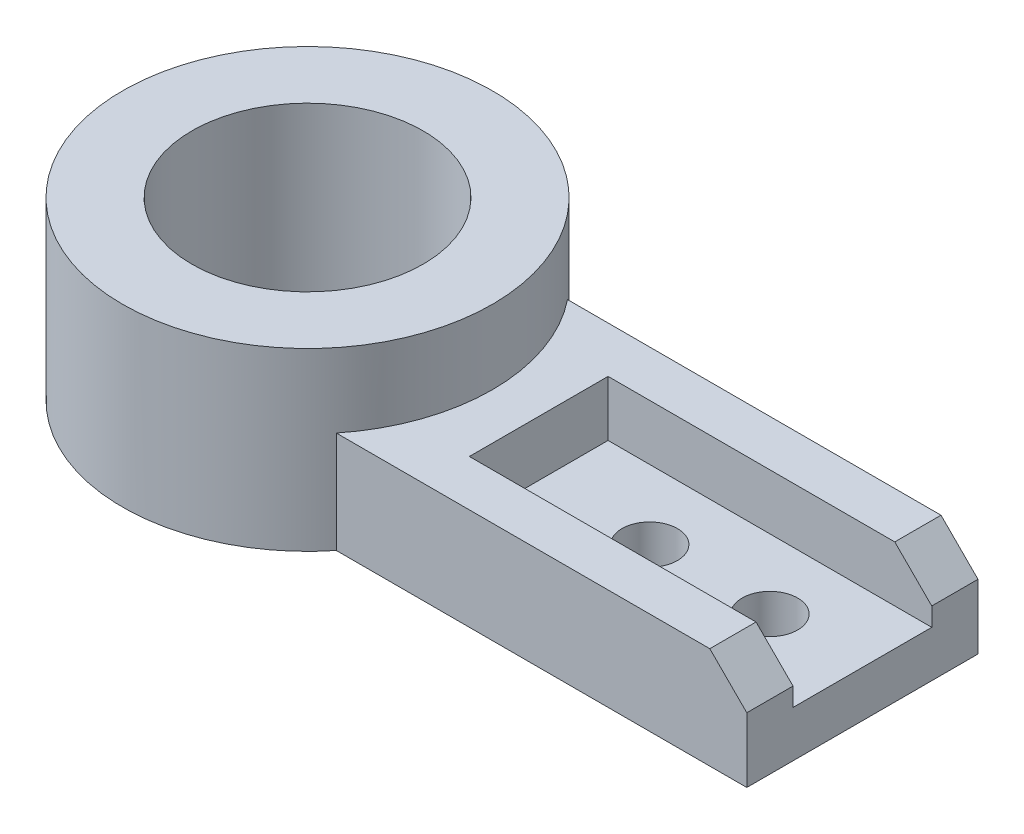
ISO-10303-21;
HEADER;
FILE_DESCRIPTION(('STEP AP214'),'2;1');
FILE_NAME('part.step','',(''),(''),'','','');
FILE_SCHEMA(('AUTOMOTIVE_DESIGN { 1 0 10303 214 1 1 1 1 }'));
ENDSEC;
DATA;
#1=APPLICATION_CONTEXT('core data for automotive mechanical design processes');
#2=APPLICATION_PROTOCOL_DEFINITION('international standard','automotive_design',2000,#1);
#3=PRODUCT_CONTEXT('',#1,'mechanical');
#4=PRODUCT('Part','Part','',(#3));
#5=PRODUCT_RELATED_PRODUCT_CATEGORY('part','',(#4));
#6=PRODUCT_DEFINITION_FORMATION('','',#4);
#7=PRODUCT_DEFINITION_CONTEXT('part definition',#1,'design');
#8=PRODUCT_DEFINITION('design','',#6,#7);
#9=PRODUCT_DEFINITION_SHAPE('','',#8);
#10=(LENGTH_UNIT() NAMED_UNIT(*) SI_UNIT(.MILLI.,.METRE.));
#11=(NAMED_UNIT(*) PLANE_ANGLE_UNIT() SI_UNIT($,.RADIAN.));
#12=(NAMED_UNIT(*) SI_UNIT($,.STERADIAN.) SOLID_ANGLE_UNIT());
#13=UNCERTAINTY_MEASURE_WITH_UNIT(LENGTH_MEASURE(1.E-05),#10,'distance_accuracy_value','');
#14=(GEOMETRIC_REPRESENTATION_CONTEXT(3) GLOBAL_UNCERTAINTY_ASSIGNED_CONTEXT((#13)) GLOBAL_UNIT_ASSIGNED_CONTEXT((#10,
#11,#12)) REPRESENTATION_CONTEXT('',''));
#15=CARTESIAN_POINT('',(0.,0.,0.));
#16=DIRECTION('',(0.,0.,1.));
#17=DIRECTION('',(1.,0.,0.));
#18=AXIS2_PLACEMENT_3D('',#15,#16,#17);
#19=CARTESIAN_POINT('',(0.,55.,0.));
#20=DIRECTION('',(0.,1.,0.));
#21=DIRECTION('',(0.,0.,1.));
#22=AXIS2_PLACEMENT_3D('',#19,#20,#21);
#23=PLANE('',#22);
#24=DIRECTION('',(-1.,0.,0.));
#25=VECTOR('',#24,1.);
#26=CARTESIAN_POINT('',(0.,55.,62.5));
#27=LINE('',#26,#25);
#28=CARTESIAN_POINT('',(280.,55.,62.5));
#29=VERTEX_POINT('',#28);
#30=CARTESIAN_POINT('',(78.06247497998,55.,62.5));
#31=VERTEX_POINT('',#30);
#32=EDGE_CURVE('E117',#29,#31,#27,.T.);
#33=ORIENTED_EDGE('',*,*,#32,.F.);
#34=DIRECTION('',(0.,0.,-1.));
#35=VECTOR('',#34,1.);
#36=CARTESIAN_POINT('',(280.,55.,0.));
#37=LINE('',#36,#35);
#38=CARTESIAN_POINT('',(280.,55.,37.5));
#39=VERTEX_POINT('',#38);
#40=EDGE_CURVE('E64',#29,#39,#37,.T.);
#41=ORIENTED_EDGE('',*,*,#40,.T.);
#42=DIRECTION('',(1.,0.,0.));
#43=VECTOR('',#42,1.);
#44=CARTESIAN_POINT('',(0.,55.,37.5));
#45=LINE('',#44,#43);
#46=CARTESIAN_POINT('',(125.,55.,37.5));
#47=VERTEX_POINT('',#46);
#48=EDGE_CURVE('E127',#47,#39,#45,.T.);
#49=ORIENTED_EDGE('',*,*,#48,.F.);
#50=DIRECTION('',(0.,0.,1.));
#51=VECTOR('',#50,1.);
#52=CARTESIAN_POINT('',(125.,55.,0.));
#53=LINE('',#52,#51);
#54=CARTESIAN_POINT('',(125.,55.,-37.5));
#55=VERTEX_POINT('',#54);
#56=EDGE_CURVE('E414',#55,#47,#53,.T.);
#57=ORIENTED_EDGE('',*,*,#56,.F.);
#58=DIRECTION('',(-1.,0.,0.));
#59=VECTOR('',#58,1.);
#60=CARTESIAN_POINT('',(0.,55.,-37.5));
#61=LINE('',#60,#59);
#62=CARTESIAN_POINT('',(280.,55.,-37.5));
#63=VERTEX_POINT('',#62);
#64=EDGE_CURVE('E418',#63,#55,#61,.T.);
#65=ORIENTED_EDGE('',*,*,#64,.F.);
#66=DIRECTION('',(0.,0.,-1.));
#67=VECTOR('',#66,1.);
#68=CARTESIAN_POINT('',(280.,55.,0.));
#69=LINE('',#68,#67);
#70=CARTESIAN_POINT('',(280.,55.,-62.5));
#71=VERTEX_POINT('',#70);
#72=EDGE_CURVE('E159',#63,#71,#69,.T.);
#73=ORIENTED_EDGE('',*,*,#72,.T.);
#74=DIRECTION('',(1.,0.,0.));
#75=VECTOR('',#74,1.);
#76=CARTESIAN_POINT('',(0.,55.,-62.5));
#77=LINE('',#76,#75);
#78=CARTESIAN_POINT('',(78.06247497998,55.,-62.5));
#79=VERTEX_POINT('',#78);
#80=EDGE_CURVE('E128',#79,#71,#77,.T.);
#81=ORIENTED_EDGE('',*,*,#80,.F.);
#82=CARTESIAN_POINT('',(0.,55.,0.));
#83=DIRECTION('',(0.,1.,0.));
#84=DIRECTION('',(0.,0.,1.));
#85=AXIS2_PLACEMENT_3D('',#82,#83,#84);
#86=CIRCLE('',#85,100.);
#87=EDGE_CURVE('E134',#79,#31,#86,.F.);
#88=ORIENTED_EDGE('',*,*,#87,.T.);
#89=EDGE_LOOP('',(#33,#41,#49,#57,#65,#73,#81,#88));
#90=FACE_BOUND('',#89,.T.);
#91=ADVANCED_FACE('F41',(#90),#23,.T.);
#92=CARTESIAN_POINT('',(0.,25.,-62.5));
#93=DIRECTION('',(0.,0.,-1.));
#94=DIRECTION('',(-1.,0.,0.));
#95=AXIS2_PLACEMENT_3D('',#92,#93,#94);
#96=PLANE('',#95);
#97=ORIENTED_EDGE('',*,*,#80,.T.);
#98=DIRECTION('',(-0.707106781186549,0.707106781186547,0.));
#99=VECTOR('',#98,1.);
#100=CARTESIAN_POINT('',(155.,180.,-62.5));
#101=LINE('',#100,#99);
#102=CARTESIAN_POINT('',(300.,35.,-62.5));
#103=VERTEX_POINT('',#102);
#104=EDGE_CURVE('E11',#71,#103,#101,.F.);
#105=ORIENTED_EDGE('',*,*,#104,.T.);
#106=DIRECTION('',(0.,-1.,0.));
#107=VECTOR('',#106,1.);
#108=CARTESIAN_POINT('',(300.,25.,-62.5));
#109=LINE('',#108,#107);
#110=CARTESIAN_POINT('',(300.,0.,-62.5));
#111=VERTEX_POINT('',#110);
#112=EDGE_CURVE('E443',#103,#111,#109,.T.);
#113=ORIENTED_EDGE('',*,*,#112,.T.);
#114=DIRECTION('',(1.,0.,0.));
#115=VECTOR('',#114,1.);
#116=CARTESIAN_POINT('',(0.,0.,-62.5));
#117=LINE('',#116,#115);
#118=CARTESIAN_POINT('',(78.06247497998,0.,-62.5));
#119=VERTEX_POINT('',#118);
#120=EDGE_CURVE('E440',#119,#111,#117,.T.);
#121=ORIENTED_EDGE('',*,*,#120,.F.);
#122=DIRECTION('',(0.,-1.,0.));
#123=VECTOR('',#122,1.);
#124=CARTESIAN_POINT('',(78.06247497998,25.,-62.5));
#125=LINE('',#124,#123);
#126=EDGE_CURVE('E139',#79,#119,#125,.T.);
#127=ORIENTED_EDGE('',*,*,#126,.F.);
#128=EDGE_LOOP('',(#97,#105,#113,#121,#127));
#129=FACE_BOUND('',#128,.T.);
#130=ADVANCED_FACE('F197',(#129),#96,.T.);
#131=CARTESIAN_POINT('',(0.,25.,0.));
#132=DIRECTION('',(0.,-1.,0.));
#133=DIRECTION('',(0.,0.,-1.));
#134=AXIS2_PLACEMENT_3D('',#131,#132,#133);
#135=CYLINDRICAL_SURFACE('',#134,100.);
#136=CARTESIAN_POINT('',(0.,0.,0.));
#137=DIRECTION('',(0.,1.,0.));
#138=DIRECTION('',(0.,0.,1.));
#139=AXIS2_PLACEMENT_3D('',#136,#137,#138);
#140=CIRCLE('',#139,100.);
#141=CARTESIAN_POINT('',(78.06247497998,0.,62.5));
#142=VERTEX_POINT('',#141);
#143=EDGE_CURVE('E136',#119,#142,#140,.T.);
#144=ORIENTED_EDGE('',*,*,#143,.T.);
#145=DIRECTION('',(0.,-1.,0.));
#146=VECTOR('',#145,1.);
#147=CARTESIAN_POINT('',(78.06247497998,25.,62.5));
#148=LINE('',#147,#146);
#149=EDGE_CURVE('E122',#31,#142,#148,.T.);
#150=ORIENTED_EDGE('',*,*,#149,.F.);
#151=ORIENTED_EDGE('',*,*,#87,.F.);
#152=ORIENTED_EDGE('',*,*,#126,.T.);
#153=EDGE_LOOP('',(#144,#150,#151,#152));
#154=FACE_BOUND('',#153,.T.);
#155=CARTESIAN_POINT('',(0.,95.,0.));
#156=DIRECTION('',(0.,1.,0.));
#157=DIRECTION('',(0.,0.,1.));
#158=AXIS2_PLACEMENT_3D('',#155,#156,#157);
#159=CIRCLE('',#158,100.);
#160=CARTESIAN_POINT('',(0.,95.,100.));
#161=VERTEX_POINT('',#160);
#162=EDGE_CURVE('E396',#161,#161,#159,.T.);
#163=ORIENTED_EDGE('',*,*,#162,.F.);
#164=EDGE_LOOP('',(#163));
#165=FACE_BOUND('',#164,.T.);
#166=ADVANCED_FACE('F132',(#154,#165),#135,.T.);
#167=CARTESIAN_POINT('',(0.,25.,62.5));
#168=DIRECTION('',(0.,0.,1.));
#169=DIRECTION('',(1.,0.,0.));
#170=AXIS2_PLACEMENT_3D('',#167,#168,#169);
#171=PLANE('',#170);
#172=DIRECTION('',(0.,-1.,0.));
#173=VECTOR('',#172,1.);
#174=CARTESIAN_POINT('',(300.,25.,62.5));
#175=LINE('',#174,#173);
#176=CARTESIAN_POINT('',(300.,35.,62.5));
#177=VERTEX_POINT('',#176);
#178=CARTESIAN_POINT('',(300.,0.,62.5));
#179=VERTEX_POINT('',#178);
#180=EDGE_CURVE('E140',#177,#179,#175,.T.);
#181=ORIENTED_EDGE('',*,*,#180,.F.);
#182=DIRECTION('',(0.707106781186549,-0.707106781186547,0.));
#183=VECTOR('',#182,1.);
#184=CARTESIAN_POINT('',(155.,180.,62.5));
#185=LINE('',#184,#183);
#186=EDGE_CURVE('E124',#177,#29,#185,.F.);
#187=ORIENTED_EDGE('',*,*,#186,.T.);
#188=ORIENTED_EDGE('',*,*,#32,.T.);
#189=ORIENTED_EDGE('',*,*,#149,.T.);
#190=DIRECTION('',(-1.,0.,0.));
#191=VECTOR('',#190,1.);
#192=CARTESIAN_POINT('',(0.,0.,62.5));
#193=LINE('',#192,#191);
#194=EDGE_CURVE('E450',#179,#142,#193,.T.);
#195=ORIENTED_EDGE('',*,*,#194,.F.);
#196=EDGE_LOOP('',(#181,#187,#188,#189,#195));
#197=FACE_BOUND('',#196,.T.);
#198=ADVANCED_FACE('F120',(#197),#171,.T.);
#199=CARTESIAN_POINT('',(300.,25.,0.));
#200=DIRECTION('',(1.,0.,0.));
#201=DIRECTION('',(0.,0.,-1.));
#202=AXIS2_PLACEMENT_3D('',#199,#200,#201);
#203=PLANE('',#202);
#204=DIRECTION('',(0.,-1.,0.));
#205=VECTOR('',#204,1.);
#206=CARTESIAN_POINT('',(300.,55.,37.5));
#207=LINE('',#206,#205);
#208=CARTESIAN_POINT('',(300.,35.,37.5));
#209=VERTEX_POINT('',#208);
#210=CARTESIAN_POINT('',(300.,25.,37.5));
#211=VERTEX_POINT('',#210);
#212=EDGE_CURVE('E171',#209,#211,#207,.T.);
#213=ORIENTED_EDGE('',*,*,#212,.F.);
#214=DIRECTION('',(0.,0.,1.));
#215=VECTOR('',#214,1.);
#216=CARTESIAN_POINT('',(300.,35.,0.));
#217=LINE('',#216,#215);
#218=EDGE_CURVE('E150',#209,#177,#217,.T.);
#219=ORIENTED_EDGE('',*,*,#218,.T.);
#220=ORIENTED_EDGE('',*,*,#180,.T.);
#221=DIRECTION('',(0.,0.,1.));
#222=VECTOR('',#221,1.);
#223=CARTESIAN_POINT('',(300.,0.,0.));
#224=LINE('',#223,#222);
#225=EDGE_CURVE('E453',#111,#179,#224,.T.);
#226=ORIENTED_EDGE('',*,*,#225,.F.);
#227=ORIENTED_EDGE('',*,*,#112,.F.);
#228=DIRECTION('',(0.,0.,1.));
#229=VECTOR('',#228,1.);
#230=CARTESIAN_POINT('',(300.,35.,0.));
#231=LINE('',#230,#229);
#232=CARTESIAN_POINT('',(300.,35.,-37.5));
#233=VERTEX_POINT('',#232);
#234=EDGE_CURVE('E145',#103,#233,#231,.T.);
#235=ORIENTED_EDGE('',*,*,#234,.T.);
#236=DIRECTION('',(0.,-1.,0.));
#237=VECTOR('',#236,1.);
#238=CARTESIAN_POINT('',(300.,55.,-37.5));
#239=LINE('',#238,#237);
#240=CARTESIAN_POINT('',(300.,25.,-37.5));
#241=VERTEX_POINT('',#240);
#242=EDGE_CURVE('E421',#233,#241,#239,.T.);
#243=ORIENTED_EDGE('',*,*,#242,.T.);
#244=DIRECTION('',(0.,0.,1.));
#245=VECTOR('',#244,1.);
#246=CARTESIAN_POINT('',(300.,25.,0.));
#247=LINE('',#246,#245);
#248=EDGE_CURVE('E179',#241,#211,#247,.T.);
#249=ORIENTED_EDGE('',*,*,#248,.T.);
#250=EDGE_LOOP('',(#213,#219,#220,#226,#227,#235,#243,#249));
#251=FACE_BOUND('',#250,.T.);
#252=ADVANCED_FACE('F177',(#251),#203,.T.);
#253=CARTESIAN_POINT('',(0.,25.,0.));
#254=DIRECTION('',(0.,-1.,0.));
#255=DIRECTION('',(0.,0.,-1.));
#256=AXIS2_PLACEMENT_3D('',#253,#254,#255);
#257=CYLINDRICAL_SURFACE('',#256,62.5);
#258=CARTESIAN_POINT('',(0.,0.,0.));
#259=DIRECTION('',(0.,1.,0.));
#260=DIRECTION('',(0.,0.,1.));
#261=AXIS2_PLACEMENT_3D('',#258,#259,#260);
#262=CIRCLE('',#261,62.5);
#263=CARTESIAN_POINT('',(0.,0.,62.5));
#264=VERTEX_POINT('',#263);
#265=EDGE_CURVE('E444',#264,#264,#262,.T.);
#266=ORIENTED_EDGE('',*,*,#265,.F.);
#267=EDGE_LOOP('',(#266));
#268=FACE_BOUND('',#267,.T.);
#269=CARTESIAN_POINT('',(0.,95.,0.));
#270=DIRECTION('',(0.,1.,0.));
#271=DIRECTION('',(0.,0.,1.));
#272=AXIS2_PLACEMENT_3D('',#269,#270,#271);
#273=CIRCLE('',#272,62.5);
#274=CARTESIAN_POINT('',(0.,95.,62.5));
#275=VERTEX_POINT('',#274);
#276=EDGE_CURVE('E406',#275,#275,#273,.T.);
#277=ORIENTED_EDGE('',*,*,#276,.T.);
#278=EDGE_LOOP('',(#277));
#279=FACE_BOUND('',#278,.T.);
#280=ADVANCED_FACE('F220',(#268,#279),#257,.F.);
#281=CARTESIAN_POINT('',(0.,25.,0.));
#282=DIRECTION('',(0.,1.,0.));
#283=DIRECTION('',(0.,0.,1.));
#284=AXIS2_PLACEMENT_3D('',#281,#282,#283);
#285=PLANE('',#284);
#286=CARTESIAN_POINT('',(185.,25.,0.));
#287=DIRECTION('',(0.,1.,0.));
#288=DIRECTION('',(0.,0.,1.));
#289=AXIS2_PLACEMENT_3D('',#286,#287,#288);
#290=CIRCLE('',#289,15.);
#291=CARTESIAN_POINT('',(185.,25.,15.));
#292=VERTEX_POINT('',#291);
#293=EDGE_CURVE('E399',#292,#292,#290,.T.);
#294=ORIENTED_EDGE('',*,*,#293,.F.);
#295=EDGE_LOOP('',(#294));
#296=FACE_BOUND('',#295,.T.);
#297=CARTESIAN_POINT('',(250.,25.,0.));
#298=DIRECTION('',(0.,1.,0.));
#299=DIRECTION('',(0.,0.,1.));
#300=AXIS2_PLACEMENT_3D('',#297,#298,#299);
#301=CIRCLE('',#300,15.);
#302=CARTESIAN_POINT('',(250.,25.,15.));
#303=VERTEX_POINT('',#302);
#304=EDGE_CURVE('E389',#303,#303,#301,.T.);
#305=ORIENTED_EDGE('',*,*,#304,.F.);
#306=EDGE_LOOP('',(#305));
#307=FACE_BOUND('',#306,.T.);
#308=DIRECTION('',(-1.,0.,0.));
#309=VECTOR('',#308,1.);
#310=CARTESIAN_POINT('',(0.,25.,37.5));
#311=LINE('',#310,#309);
#312=CARTESIAN_POINT('',(125.,25.,37.5));
#313=VERTEX_POINT('',#312);
#314=EDGE_CURVE('E437',#211,#313,#311,.T.);
#315=ORIENTED_EDGE('',*,*,#314,.F.);
#316=ORIENTED_EDGE('',*,*,#248,.F.);
#317=DIRECTION('',(1.,0.,0.));
#318=VECTOR('',#317,1.);
#319=CARTESIAN_POINT('',(0.,25.,-37.5));
#320=LINE('',#319,#318);
#321=CARTESIAN_POINT('',(125.,25.,-37.5));
#322=VERTEX_POINT('',#321);
#323=EDGE_CURVE('E181',#322,#241,#320,.T.);
#324=ORIENTED_EDGE('',*,*,#323,.F.);
#325=DIRECTION('',(0.,0.,-1.));
#326=VECTOR('',#325,1.);
#327=CARTESIAN_POINT('',(125.,25.,0.));
#328=LINE('',#327,#326);
#329=EDGE_CURVE('E434',#313,#322,#328,.T.);
#330=ORIENTED_EDGE('',*,*,#329,.F.);
#331=EDGE_LOOP('',(#315,#316,#324,#330));
#332=FACE_BOUND('',#331,.T.);
#333=ADVANCED_FACE('F217',(#296,#307,#332),#285,.T.);
#334=CARTESIAN_POINT('',(0.,0.,0.));
#335=DIRECTION('',(0.,1.,0.));
#336=DIRECTION('',(0.,0.,1.));
#337=AXIS2_PLACEMENT_3D('',#334,#335,#336);
#338=PLANE('',#337);
#339=CARTESIAN_POINT('',(185.,0.,0.));
#340=DIRECTION('',(0.,1.,0.));
#341=DIRECTION('',(0.,0.,1.));
#342=AXIS2_PLACEMENT_3D('',#339,#340,#341);
#343=CIRCLE('',#342,15.);
#344=CARTESIAN_POINT('',(185.,0.,15.));
#345=VERTEX_POINT('',#344);
#346=EDGE_CURVE('E392',#345,#345,#343,.T.);
#347=ORIENTED_EDGE('',*,*,#346,.T.);
#348=EDGE_LOOP('',(#347));
#349=FACE_BOUND('',#348,.T.);
#350=CARTESIAN_POINT('',(250.,0.,0.));
#351=DIRECTION('',(0.,1.,0.));
#352=DIRECTION('',(0.,0.,1.));
#353=AXIS2_PLACEMENT_3D('',#350,#351,#352);
#354=CIRCLE('',#353,15.);
#355=CARTESIAN_POINT('',(250.,0.,15.));
#356=VERTEX_POINT('',#355);
#357=EDGE_CURVE('E386',#356,#356,#354,.T.);
#358=ORIENTED_EDGE('',*,*,#357,.T.);
#359=EDGE_LOOP('',(#358));
#360=FACE_BOUND('',#359,.T.);
#361=ORIENTED_EDGE('',*,*,#143,.F.);
#362=ORIENTED_EDGE('',*,*,#120,.T.);
#363=ORIENTED_EDGE('',*,*,#225,.T.);
#364=ORIENTED_EDGE('',*,*,#194,.T.);
#365=EDGE_LOOP('',(#361,#362,#363,#364));
#366=FACE_BOUND('',#365,.T.);
#367=ORIENTED_EDGE('',*,*,#265,.T.);
#368=EDGE_LOOP('',(#367));
#369=FACE_BOUND('',#368,.T.);
#370=ADVANCED_FACE('F216',(#349,#360,#366,#369),#338,.F.);
#371=CARTESIAN_POINT('',(0.,55.,37.5));
#372=DIRECTION('',(0.,0.,-1.));
#373=DIRECTION('',(-1.,0.,0.));
#374=AXIS2_PLACEMENT_3D('',#371,#372,#373);
#375=PLANE('',#374);
#376=ORIENTED_EDGE('',*,*,#48,.T.);
#377=DIRECTION('',(-0.707106781186549,0.707106781186547,0.));
#378=VECTOR('',#377,1.);
#379=CARTESIAN_POINT('',(140.,195.,37.5));
#380=LINE('',#379,#378);
#381=EDGE_CURVE('E164',#39,#209,#380,.F.);
#382=ORIENTED_EDGE('',*,*,#381,.T.);
#383=ORIENTED_EDGE('',*,*,#212,.T.);
#384=ORIENTED_EDGE('',*,*,#314,.T.);
#385=DIRECTION('',(0.,-1.,0.));
#386=VECTOR('',#385,1.);
#387=CARTESIAN_POINT('',(125.,55.,37.5));
#388=LINE('',#387,#386);
#389=EDGE_CURVE('E182',#47,#313,#388,.T.);
#390=ORIENTED_EDGE('',*,*,#389,.F.);
#391=EDGE_LOOP('',(#376,#382,#383,#384,#390));
#392=FACE_BOUND('',#391,.T.);
#393=ADVANCED_FACE('F170',(#392),#375,.T.);
#394=CARTESIAN_POINT('',(125.,55.,0.));
#395=DIRECTION('',(1.,0.,0.));
#396=DIRECTION('',(0.,0.,-1.));
#397=AXIS2_PLACEMENT_3D('',#394,#395,#396);
#398=PLANE('',#397);
#399=ORIENTED_EDGE('',*,*,#389,.T.);
#400=ORIENTED_EDGE('',*,*,#329,.T.);
#401=DIRECTION('',(0.,-1.,0.));
#402=VECTOR('',#401,1.);
#403=CARTESIAN_POINT('',(125.,55.,-37.5));
#404=LINE('',#403,#402);
#405=EDGE_CURVE('E424',#55,#322,#404,.T.);
#406=ORIENTED_EDGE('',*,*,#405,.F.);
#407=ORIENTED_EDGE('',*,*,#56,.T.);
#408=EDGE_LOOP('',(#399,#400,#406,#407));
#409=FACE_BOUND('',#408,.T.);
#410=ADVANCED_FACE('F210',(#409),#398,.T.);
#411=CARTESIAN_POINT('',(0.,55.,-37.5));
#412=DIRECTION('',(0.,0.,1.));
#413=DIRECTION('',(1.,0.,0.));
#414=AXIS2_PLACEMENT_3D('',#411,#412,#413);
#415=PLANE('',#414);
#416=ORIENTED_EDGE('',*,*,#242,.F.);
#417=DIRECTION('',(0.707106781186549,-0.707106781186547,0.));
#418=VECTOR('',#417,1.);
#419=CARTESIAN_POINT('',(140.,195.,-37.5));
#420=LINE('',#419,#418);
#421=EDGE_CURVE('E50',#233,#63,#420,.F.);
#422=ORIENTED_EDGE('',*,*,#421,.T.);
#423=ORIENTED_EDGE('',*,*,#64,.T.);
#424=ORIENTED_EDGE('',*,*,#405,.T.);
#425=ORIENTED_EDGE('',*,*,#323,.T.);
#426=EDGE_LOOP('',(#416,#422,#423,#424,#425));
#427=FACE_BOUND('',#426,.T.);
#428=ADVANCED_FACE('F207',(#427),#415,.T.);
#429=CARTESIAN_POINT('',(0.,95.,0.));
#430=DIRECTION('',(0.,1.,0.));
#431=DIRECTION('',(0.,0.,1.));
#432=AXIS2_PLACEMENT_3D('',#429,#430,#431);
#433=PLANE('',#432);
#434=ORIENTED_EDGE('',*,*,#162,.T.);
#435=EDGE_LOOP('',(#434));
#436=FACE_BOUND('',#435,.T.);
#437=ORIENTED_EDGE('',*,*,#276,.F.);
#438=EDGE_LOOP('',(#437));
#439=FACE_BOUND('',#438,.T.);
#440=ADVANCED_FACE('F205',(#436,#439),#433,.T.);
#441=CARTESIAN_POINT('',(250.,0.,0.));
#442=DIRECTION('',(0.,1.,0.));
#443=DIRECTION('',(0.,0.,1.));
#444=AXIS2_PLACEMENT_3D('',#441,#442,#443);
#445=CYLINDRICAL_SURFACE('',#444,15.);
#446=ORIENTED_EDGE('',*,*,#357,.F.);
#447=EDGE_LOOP('',(#446));
#448=FACE_BOUND('',#447,.T.);
#449=ORIENTED_EDGE('',*,*,#304,.T.);
#450=EDGE_LOOP('',(#449));
#451=FACE_BOUND('',#450,.T.);
#452=ADVANCED_FACE('F192',(#448,#451),#445,.F.);
#453=CARTESIAN_POINT('',(185.,0.,0.));
#454=DIRECTION('',(0.,1.,0.));
#455=DIRECTION('',(0.,0.,1.));
#456=AXIS2_PLACEMENT_3D('',#453,#454,#455);
#457=CYLINDRICAL_SURFACE('',#456,15.);
#458=ORIENTED_EDGE('',*,*,#346,.F.);
#459=EDGE_LOOP('',(#458));
#460=FACE_BOUND('',#459,.T.);
#461=ORIENTED_EDGE('',*,*,#293,.T.);
#462=EDGE_LOOP('',(#461));
#463=FACE_BOUND('',#462,.T.);
#464=ADVANCED_FACE('F186',(#460,#463),#457,.F.);
#465=CARTESIAN_POINT('',(300.,35.,0.));
#466=DIRECTION('',(-0.707106781186547,-0.707106781186549,0.));
#467=DIRECTION('',(0.,0.,1.));
#468=AXIS2_PLACEMENT_3D('',#465,#466,#467);
#469=PLANE('',#468);
#470=ORIENTED_EDGE('',*,*,#381,.F.);
#471=ORIENTED_EDGE('',*,*,#40,.F.);
#472=ORIENTED_EDGE('',*,*,#186,.F.);
#473=ORIENTED_EDGE('',*,*,#218,.F.);
#474=EDGE_LOOP('',(#470,#471,#472,#473));
#475=FACE_BOUND('',#474,.T.);
#476=ADVANCED_FACE('F184',(#475),#469,.F.);
#477=CARTESIAN_POINT('',(300.,35.,0.));
#478=DIRECTION('',(-0.707106781186547,-0.707106781186549,0.));
#479=DIRECTION('',(0.,0.,1.));
#480=AXIS2_PLACEMENT_3D('',#477,#478,#479);
#481=PLANE('',#480);
#482=ORIENTED_EDGE('',*,*,#104,.F.);
#483=ORIENTED_EDGE('',*,*,#72,.F.);
#484=ORIENTED_EDGE('',*,*,#421,.F.);
#485=ORIENTED_EDGE('',*,*,#234,.F.);
#486=EDGE_LOOP('',(#482,#483,#484,#485));
#487=FACE_BOUND('',#486,.T.);
#488=ADVANCED_FACE('F43',(#487),#481,.F.);
#489=CLOSED_SHELL('',(#91,#130,#166,#198,#252,#280,#333,#370,#393,#410,#428,#440,#452,#464,#476,#488));
#490=MANIFOLD_SOLID_BREP('B2',#489);
#491=ADVANCED_BREP_SHAPE_REPRESENTATION('',(#18,#490),#14);
#492=SHAPE_DEFINITION_REPRESENTATION(#9,#491);
ENDSEC;
END-ISO-10303-21;
